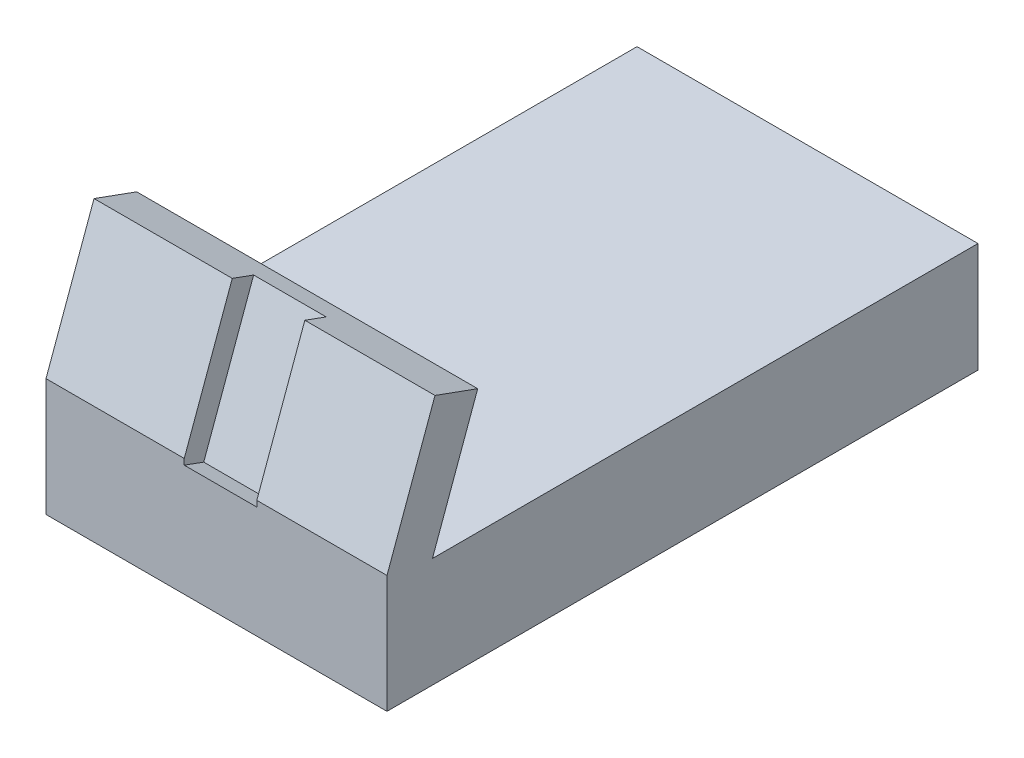
ISO-10303-21;
HEADER;
FILE_DESCRIPTION(('STEP AP214'),'2;1');
FILE_NAME('part.step','',(''),(''),'','','');
FILE_SCHEMA(('AUTOMOTIVE_DESIGN { 1 0 10303 214 1 1 1 1 }'));
ENDSEC;
DATA;
#1=APPLICATION_CONTEXT('core data for automotive mechanical design processes');
#2=APPLICATION_PROTOCOL_DEFINITION('international standard','automotive_design',2000,#1);
#3=PRODUCT_CONTEXT('',#1,'mechanical');
#4=PRODUCT('Part','Part','',(#3));
#5=PRODUCT_RELATED_PRODUCT_CATEGORY('part','',(#4));
#6=PRODUCT_DEFINITION_FORMATION('','',#4);
#7=PRODUCT_DEFINITION_CONTEXT('part definition',#1,'design');
#8=PRODUCT_DEFINITION('design','',#6,#7);
#9=PRODUCT_DEFINITION_SHAPE('','',#8);
#10=(LENGTH_UNIT() NAMED_UNIT(*) SI_UNIT(.MILLI.,.METRE.));
#11=(NAMED_UNIT(*) PLANE_ANGLE_UNIT() SI_UNIT($,.RADIAN.));
#12=(NAMED_UNIT(*) SI_UNIT($,.STERADIAN.) SOLID_ANGLE_UNIT());
#13=UNCERTAINTY_MEASURE_WITH_UNIT(LENGTH_MEASURE(1.E-05),#10,'distance_accuracy_value','');
#14=(GEOMETRIC_REPRESENTATION_CONTEXT(3) GLOBAL_UNCERTAINTY_ASSIGNED_CONTEXT((#13)) GLOBAL_UNIT_ASSIGNED_CONTEXT((#10,
#11,#12)) REPRESENTATION_CONTEXT('',''));
#15=CARTESIAN_POINT('',(0.,0.,0.));
#16=DIRECTION('',(0.,0.,1.));
#17=DIRECTION('',(1.,0.,0.));
#18=AXIS2_PLACEMENT_3D('',#15,#16,#17);
#19=CARTESIAN_POINT('',(-75.,13.8232698070846,65.));
#20=DIRECTION('',(0.,0.342020143325673,0.939692620785907));
#21=DIRECTION('',(0.,-0.939692620785907,0.342020143325673));
#22=AXIS2_PLACEMENT_3D('',#19,#20,#21);
#23=PLANE('',#22);
#24=DIRECTION('',(0.,-0.939692620785907,0.342020143325673));
#25=VECTOR('',#24,1.);
#26=CARTESIAN_POINT('',(-44.591821510971,12.6862417359337,65.4138443734241));
#27=LINE('',#26,#25);
#28=CARTESIAN_POINT('',(-44.591821510971,42.8409779369535,54.4384179741032));
#29=VERTEX_POINT('',#28);
#30=CARTESIAN_POINT('',(-44.591821510971,13.8232698070847,65.));
#31=VERTEX_POINT('',#30);
#32=EDGE_CURVE('E187',#29,#31,#27,.T.);
#33=ORIENTED_EDGE('',*,*,#32,.F.);
#34=DIRECTION('',(1.,0.,0.));
#35=VECTOR('',#34,1.);
#36=CARTESIAN_POINT('',(-75.,42.8409779369535,54.4384179741032));
#37=LINE('',#36,#35);
#38=CARTESIAN_POINT('',(-75.,42.8409779369535,54.4384179741032));
#39=VERTEX_POINT('',#38);
#40=EDGE_CURVE('E137',#39,#29,#37,.T.);
#41=ORIENTED_EDGE('',*,*,#40,.F.);
#42=DIRECTION('',(0.,-0.939692620785907,0.342020143325673));
#43=VECTOR('',#42,1.);
#44=CARTESIAN_POINT('',(-75.,13.8232698070846,65.));
#45=LINE('',#44,#43);
#46=CARTESIAN_POINT('',(-75.,13.8232698070846,65.));
#47=VERTEX_POINT('',#46);
#48=EDGE_CURVE('E132',#39,#47,#45,.T.);
#49=ORIENTED_EDGE('',*,*,#48,.T.);
#50=DIRECTION('',(1.,0.,0.));
#51=VECTOR('',#50,1.);
#52=CARTESIAN_POINT('',(-75.,13.8232698070846,65.));
#53=LINE('',#52,#51);
#54=EDGE_CURVE('E113',#47,#31,#53,.T.);
#55=ORIENTED_EDGE('',*,*,#54,.T.);
#56=EDGE_LOOP('',(#33,#41,#49,#55));
#57=FACE_BOUND('',#56,.T.);
#58=ADVANCED_FACE('F36',(#57),#23,.T.);
#59=CARTESIAN_POINT('',(-75.,-12.06,-65.));
#60=DIRECTION('',(0.,0.,-1.));
#61=DIRECTION('',(-1.,0.,0.));
#62=AXIS2_PLACEMENT_3D('',#59,#60,#61);
#63=PLANE('',#62);
#64=DIRECTION('',(0.,1.,0.));
#65=VECTOR('',#64,1.);
#66=CARTESIAN_POINT('',(0.,-12.06,-65.));
#67=LINE('',#66,#65);
#68=CARTESIAN_POINT('',(0.,-12.06,-65.));
#69=VERTEX_POINT('',#68);
#70=CARTESIAN_POINT('',(0.,12.06,-65.));
#71=VERTEX_POINT('',#70);
#72=EDGE_CURVE('E145',#69,#71,#67,.T.);
#73=ORIENTED_EDGE('',*,*,#72,.F.);
#74=DIRECTION('',(1.,0.,0.));
#75=VECTOR('',#74,1.);
#76=CARTESIAN_POINT('',(-75.,-12.06,-65.));
#77=LINE('',#76,#75);
#78=CARTESIAN_POINT('',(-75.,-12.06,-65.));
#79=VERTEX_POINT('',#78);
#80=EDGE_CURVE('E60',#79,#69,#77,.T.);
#81=ORIENTED_EDGE('',*,*,#80,.F.);
#82=DIRECTION('',(0.,1.,0.));
#83=VECTOR('',#82,1.);
#84=CARTESIAN_POINT('',(-75.,-12.06,-65.));
#85=LINE('',#84,#83);
#86=CARTESIAN_POINT('',(-75.,12.06,-65.));
#87=VERTEX_POINT('',#86);
#88=EDGE_CURVE('E166',#79,#87,#85,.T.);
#89=ORIENTED_EDGE('',*,*,#88,.T.);
#90=DIRECTION('',(1.,0.,0.));
#91=VECTOR('',#90,1.);
#92=CARTESIAN_POINT('',(-75.,12.06,-65.));
#93=LINE('',#92,#91);
#94=EDGE_CURVE('E96',#87,#71,#93,.T.);
#95=ORIENTED_EDGE('',*,*,#94,.T.);
#96=EDGE_LOOP('',(#73,#81,#89,#95));
#97=FACE_BOUND('',#96,.T.);
#98=ADVANCED_FACE('F38',(#97),#63,.T.);
#99=CARTESIAN_POINT('',(-75.,-12.06,-65.));
#100=DIRECTION('',(0.,-1.,0.));
#101=DIRECTION('',(0.,0.,-1.));
#102=AXIS2_PLACEMENT_3D('',#99,#100,#101);
#103=PLANE('',#102);
#104=DIRECTION('',(0.,0.,-1.));
#105=VECTOR('',#104,1.);
#106=CARTESIAN_POINT('',(0.,-12.06,-65.));
#107=LINE('',#106,#105);
#108=CARTESIAN_POINT('',(0.,-12.06,65.));
#109=VERTEX_POINT('',#108);
#110=EDGE_CURVE('E163',#109,#69,#107,.T.);
#111=ORIENTED_EDGE('',*,*,#110,.F.);
#112=DIRECTION('',(1.,0.,0.));
#113=VECTOR('',#112,1.);
#114=CARTESIAN_POINT('',(-75.,-12.06,65.));
#115=LINE('',#114,#113);
#116=CARTESIAN_POINT('',(-75.,-12.06,65.));
#117=VERTEX_POINT('',#116);
#118=EDGE_CURVE('E125',#117,#109,#115,.T.);
#119=ORIENTED_EDGE('',*,*,#118,.F.);
#120=DIRECTION('',(0.,0.,-1.));
#121=VECTOR('',#120,1.);
#122=CARTESIAN_POINT('',(-75.,-12.06,-65.));
#123=LINE('',#122,#121);
#124=EDGE_CURVE('E134',#117,#79,#123,.T.);
#125=ORIENTED_EDGE('',*,*,#124,.T.);
#126=ORIENTED_EDGE('',*,*,#80,.T.);
#127=EDGE_LOOP('',(#111,#119,#125,#126));
#128=FACE_BOUND('',#127,.T.);
#129=ADVANCED_FACE('F249',(#128),#103,.T.);
#130=CARTESIAN_POINT('',(-75.,13.8232698070846,65.));
#131=DIRECTION('',(0.,0.,1.));
#132=DIRECTION('',(1.,0.,0.));
#133=AXIS2_PLACEMENT_3D('',#130,#131,#132);
#134=PLANE('',#133);
#135=DIRECTION('',(0.,-1.,0.));
#136=VECTOR('',#135,1.);
#137=CARTESIAN_POINT('',(-44.591821510971,13.8232698070846,65.));
#138=LINE('',#137,#136);
#139=CARTESIAN_POINT('',(-44.591821510971,12.5356147023888,65.));
#140=VERTEX_POINT('',#139);
#141=EDGE_CURVE('E121',#31,#140,#138,.T.);
#142=ORIENTED_EDGE('',*,*,#141,.F.);
#143=ORIENTED_EDGE('',*,*,#54,.F.);
#144=DIRECTION('',(0.,-1.,0.));
#145=VECTOR('',#144,1.);
#146=CARTESIAN_POINT('',(-75.,13.8232698070846,65.));
#147=LINE('',#146,#145);
#148=EDGE_CURVE('E116',#47,#117,#147,.T.);
#149=ORIENTED_EDGE('',*,*,#148,.T.);
#150=ORIENTED_EDGE('',*,*,#118,.T.);
#151=DIRECTION('',(0.,-1.,0.));
#152=VECTOR('',#151,1.);
#153=CARTESIAN_POINT('',(0.,13.8232698070846,65.));
#154=LINE('',#153,#152);
#155=CARTESIAN_POINT('',(0.,13.8232698070846,65.));
#156=VERTEX_POINT('',#155);
#157=EDGE_CURVE('E160',#156,#109,#154,.T.);
#158=ORIENTED_EDGE('',*,*,#157,.F.);
#159=CARTESIAN_POINT('',(-28.631821510971,13.8232698070847,65.));
#160=VERTEX_POINT('',#159);
#161=EDGE_CURVE('E126',#160,#156,#53,.T.);
#162=ORIENTED_EDGE('',*,*,#161,.F.);
#163=DIRECTION('',(0.,1.,0.));
#164=VECTOR('',#163,1.);
#165=CARTESIAN_POINT('',(-28.631821510971,13.8232698070846,65.));
#166=LINE('',#165,#164);
#167=CARTESIAN_POINT('',(-28.631821510971,12.5356147023888,65.));
#168=VERTEX_POINT('',#167);
#169=EDGE_CURVE('E209',#168,#160,#166,.T.);
#170=ORIENTED_EDGE('',*,*,#169,.F.);
#171=DIRECTION('',(1.,0.,0.));
#172=VECTOR('',#171,1.);
#173=CARTESIAN_POINT('',(-75.,12.5356147023888,65.));
#174=LINE('',#173,#172);
#175=EDGE_CURVE('E11',#140,#168,#174,.T.);
#176=ORIENTED_EDGE('',*,*,#175,.F.);
#177=EDGE_LOOP('',(#142,#143,#149,#150,#158,#162,#170,#176));
#178=FACE_BOUND('',#177,.T.);
#179=ADVANCED_FACE('F115',(#178),#134,.T.);
#180=DIRECTION('',(0.,0.939692620785907,-0.342020143325673));
#181=VECTOR('',#180,1.);
#182=CARTESIAN_POINT('',(-28.631821510971,12.6862417359337,65.4138443734241));
#183=LINE('',#182,#181);
#184=CARTESIAN_POINT('',(-28.631821510971,42.8409779369535,54.4384179741032));
#185=VERTEX_POINT('',#184);
#186=EDGE_CURVE('E195',#160,#185,#183,.T.);
#187=ORIENTED_EDGE('',*,*,#186,.F.);
#188=ORIENTED_EDGE('',*,*,#161,.T.);
#189=DIRECTION('',(0.,-0.939692620785907,0.342020143325673));
#190=VECTOR('',#189,1.);
#191=CARTESIAN_POINT('',(0.,13.8232698070846,65.));
#192=LINE('',#191,#190);
#193=CARTESIAN_POINT('',(0.,42.8409779369535,54.4384179741032));
#194=VERTEX_POINT('',#193);
#195=EDGE_CURVE('E157',#194,#156,#192,.T.);
#196=ORIENTED_EDGE('',*,*,#195,.F.);
#197=EDGE_CURVE('E171',#185,#194,#37,.T.);
#198=ORIENTED_EDGE('',*,*,#197,.F.);
#199=EDGE_LOOP('',(#187,#188,#196,#198));
#200=FACE_BOUND('',#199,.T.);
#201=ADVANCED_FACE('F243',(#200),#23,.T.);
#202=CARTESIAN_POINT('',(-75.,42.8409779369535,54.4384179741032));
#203=DIRECTION('',(0.,0.939804404534439,-0.341712863699434));
#204=DIRECTION('',(0.,0.341712863699434,0.939804404534439));
#205=AXIS2_PLACEMENT_3D('',#202,#203,#204);
#206=PLANE('',#205);
#207=DIRECTION('',(0.,0.341712863699434,0.939804404534439));
#208=VECTOR('',#207,1.);
#209=CARTESIAN_POINT('',(-44.591821510971,42.8409779369535,54.4384179741032));
#210=LINE('',#209,#208);
#211=CARTESIAN_POINT('',(-44.591821510971,41.1324135271196,49.7393957002298));
#212=VERTEX_POINT('',#211);
#213=EDGE_CURVE('E44',#212,#29,#210,.T.);
#214=ORIENTED_EDGE('',*,*,#213,.F.);
#215=DIRECTION('',(1.,0.,0.));
#216=VECTOR('',#215,1.);
#217=CARTESIAN_POINT('',(-75.,41.1324135271196,49.7393957002298));
#218=LINE('',#217,#216);
#219=CARTESIAN_POINT('',(-28.631821510971,41.1324135271195,49.7393957002298));
#220=VERTEX_POINT('',#219);
#221=EDGE_CURVE('E168',#212,#220,#218,.T.);
#222=ORIENTED_EDGE('',*,*,#221,.T.);
#223=DIRECTION('',(0.,-0.341712863699434,-0.939804404534439));
#224=VECTOR('',#223,1.);
#225=CARTESIAN_POINT('',(-28.631821510971,42.8409779369535,54.4384179741032));
#226=LINE('',#225,#224);
#227=EDGE_CURVE('E179',#185,#220,#226,.T.);
#228=ORIENTED_EDGE('',*,*,#227,.F.);
#229=ORIENTED_EDGE('',*,*,#197,.T.);
#230=DIRECTION('',(0.,0.341712863699434,0.939804404534439));
#231=VECTOR('',#230,1.);
#232=CARTESIAN_POINT('',(0.,42.8409779369535,54.4384179741032));
#233=LINE('',#232,#231);
#234=CARTESIAN_POINT('',(0.,39.4238491172856,45.0403734263564));
#235=VERTEX_POINT('',#234);
#236=EDGE_CURVE('E154',#235,#194,#233,.T.);
#237=ORIENTED_EDGE('',*,*,#236,.F.);
#238=DIRECTION('',(1.,0.,0.));
#239=VECTOR('',#238,1.);
#240=CARTESIAN_POINT('',(-75.,39.4238491172856,45.0403734263564));
#241=LINE('',#240,#239);
#242=CARTESIAN_POINT('',(-75.,39.4238491172856,45.0403734263564));
#243=VERTEX_POINT('',#242);
#244=EDGE_CURVE('E172',#243,#235,#241,.T.);
#245=ORIENTED_EDGE('',*,*,#244,.F.);
#246=DIRECTION('',(0.,0.341712863699434,0.939804404534439));
#247=VECTOR('',#246,1.);
#248=CARTESIAN_POINT('',(-75.,42.8409779369535,54.4384179741032));
#249=LINE('',#248,#247);
#250=EDGE_CURVE('E138',#243,#39,#249,.T.);
#251=ORIENTED_EDGE('',*,*,#250,.T.);
#252=ORIENTED_EDGE('',*,*,#40,.T.);
#253=EDGE_LOOP('',(#214,#222,#228,#229,#237,#245,#251,#252));
#254=FACE_BOUND('',#253,.T.);
#255=ADVANCED_FACE('F197',(#254),#206,.T.);
#256=CARTESIAN_POINT('',(-75.,12.06,55.));
#257=DIRECTION('',(0.,-0.342020143325673,-0.939692620785907));
#258=DIRECTION('',(0.,0.939692620785907,-0.342020143325673));
#259=AXIS2_PLACEMENT_3D('',#256,#257,#258);
#260=PLANE('',#259);
#261=DIRECTION('',(0.,0.939692620785907,-0.342020143325673));
#262=VECTOR('',#261,1.);
#263=CARTESIAN_POINT('',(0.,12.06,55.));
#264=LINE('',#263,#262);
#265=CARTESIAN_POINT('',(0.,12.06,55.));
#266=VERTEX_POINT('',#265);
#267=EDGE_CURVE('E151',#266,#235,#264,.T.);
#268=ORIENTED_EDGE('',*,*,#267,.F.);
#269=DIRECTION('',(1.,0.,0.));
#270=VECTOR('',#269,1.);
#271=CARTESIAN_POINT('',(-75.,12.06,55.));
#272=LINE('',#271,#270);
#273=CARTESIAN_POINT('',(-75.,12.06,55.));
#274=VERTEX_POINT('',#273);
#275=EDGE_CURVE('E174',#274,#266,#272,.T.);
#276=ORIENTED_EDGE('',*,*,#275,.F.);
#277=DIRECTION('',(0.,0.939692620785907,-0.342020143325673));
#278=VECTOR('',#277,1.);
#279=CARTESIAN_POINT('',(-75.,12.06,55.));
#280=LINE('',#279,#278);
#281=EDGE_CURVE('E140',#274,#243,#280,.T.);
#282=ORIENTED_EDGE('',*,*,#281,.T.);
#283=ORIENTED_EDGE('',*,*,#244,.T.);
#284=EDGE_LOOP('',(#268,#276,#282,#283));
#285=FACE_BOUND('',#284,.T.);
#286=ADVANCED_FACE('F203',(#285),#260,.T.);
#287=CARTESIAN_POINT('',(-75.,12.06,-65.));
#288=DIRECTION('',(0.,1.,0.));
#289=DIRECTION('',(0.,0.,1.));
#290=AXIS2_PLACEMENT_3D('',#287,#288,#289);
#291=PLANE('',#290);
#292=DIRECTION('',(0.,0.,1.));
#293=VECTOR('',#292,1.);
#294=CARTESIAN_POINT('',(0.,12.06,-65.));
#295=LINE('',#294,#293);
#296=EDGE_CURVE('E148',#71,#266,#295,.T.);
#297=ORIENTED_EDGE('',*,*,#296,.F.);
#298=ORIENTED_EDGE('',*,*,#94,.F.);
#299=DIRECTION('',(0.,0.,1.));
#300=VECTOR('',#299,1.);
#301=CARTESIAN_POINT('',(-75.,12.06,-65.));
#302=LINE('',#301,#300);
#303=EDGE_CURVE('E204',#87,#274,#302,.T.);
#304=ORIENTED_EDGE('',*,*,#303,.T.);
#305=ORIENTED_EDGE('',*,*,#275,.T.);
#306=EDGE_LOOP('',(#297,#298,#304,#305));
#307=FACE_BOUND('',#306,.T.);
#308=ADVANCED_FACE('F248',(#307),#291,.T.);
#309=CARTESIAN_POINT('',(-75.,0.,0.));
#310=DIRECTION('',(1.,0.,0.));
#311=DIRECTION('',(0.,0.,-1.));
#312=AXIS2_PLACEMENT_3D('',#309,#310,#311);
#313=PLANE('',#312);
#314=ORIENTED_EDGE('',*,*,#88,.F.);
#315=ORIENTED_EDGE('',*,*,#124,.F.);
#316=ORIENTED_EDGE('',*,*,#148,.F.);
#317=ORIENTED_EDGE('',*,*,#48,.F.);
#318=ORIENTED_EDGE('',*,*,#250,.F.);
#319=ORIENTED_EDGE('',*,*,#281,.F.);
#320=ORIENTED_EDGE('',*,*,#303,.F.);
#321=EDGE_LOOP('',(#314,#315,#316,#317,#318,#319,#320));
#322=FACE_BOUND('',#321,.T.);
#323=ADVANCED_FACE('F130',(#322),#313,.F.);
#324=CARTESIAN_POINT('',(0.,0.,0.));
#325=DIRECTION('',(1.,0.,0.));
#326=DIRECTION('',(0.,0.,-1.));
#327=AXIS2_PLACEMENT_3D('',#324,#325,#326);
#328=PLANE('',#327);
#329=ORIENTED_EDGE('',*,*,#72,.T.);
#330=ORIENTED_EDGE('',*,*,#296,.T.);
#331=ORIENTED_EDGE('',*,*,#267,.T.);
#332=ORIENTED_EDGE('',*,*,#236,.T.);
#333=ORIENTED_EDGE('',*,*,#195,.T.);
#334=ORIENTED_EDGE('',*,*,#157,.T.);
#335=ORIENTED_EDGE('',*,*,#110,.T.);
#336=EDGE_LOOP('',(#329,#330,#331,#332,#333,#334,#335));
#337=FACE_BOUND('',#336,.T.);
#338=ADVANCED_FACE('F247',(#337),#328,.T.);
#339=CARTESIAN_POINT('',(-44.591821510971,10.9761410193053,60.7153812694946));
#340=DIRECTION('',(-1.,0.,0.));
#341=DIRECTION('',(0.,0.,1.));
#342=AXIS2_PLACEMENT_3D('',#339,#340,#341);
#343=PLANE('',#342);
#344=ORIENTED_EDGE('',*,*,#141,.T.);
#345=DIRECTION('',(0.,0.342020143325673,0.939692620785907));
#346=VECTOR('',#345,1.);
#347=CARTESIAN_POINT('',(-44.591821510971,10.9761410193053,60.7153812694946));
#348=LINE('',#347,#346);
#349=CARTESIAN_POINT('',(-44.591821510971,10.9761410193053,60.7153812694946));
#350=VERTEX_POINT('',#349);
#351=EDGE_CURVE('E213',#350,#140,#348,.T.);
#352=ORIENTED_EDGE('',*,*,#351,.F.);
#353=DIRECTION('',(0.,-0.939692620785907,0.342020143325673));
#354=VECTOR('',#353,1.);
#355=CARTESIAN_POINT('',(-44.591821510971,10.9761410193053,60.7153812694946));
#356=LINE('',#355,#354);
#357=EDGE_CURVE('E191',#212,#350,#356,.T.);
#358=ORIENTED_EDGE('',*,*,#357,.F.);
#359=ORIENTED_EDGE('',*,*,#213,.T.);
#360=ORIENTED_EDGE('',*,*,#32,.T.);
#361=EDGE_LOOP('',(#344,#352,#358,#359,#360));
#362=FACE_BOUND('',#361,.T.);
#363=ADVANCED_FACE('F186',(#362),#343,.F.);
#364=CARTESIAN_POINT('',(-28.631821510971,10.9761410193054,60.7153812694946));
#365=DIRECTION('',(1.,0.,0.));
#366=DIRECTION('',(0.,0.,-1.));
#367=AXIS2_PLACEMENT_3D('',#364,#365,#366);
#368=PLANE('',#367);
#369=ORIENTED_EDGE('',*,*,#169,.T.);
#370=ORIENTED_EDGE('',*,*,#186,.T.);
#371=ORIENTED_EDGE('',*,*,#227,.T.);
#372=DIRECTION('',(0.,0.939692620785907,-0.342020143325673));
#373=VECTOR('',#372,1.);
#374=CARTESIAN_POINT('',(-28.631821510971,10.9761410193054,60.7153812694946));
#375=LINE('',#374,#373);
#376=CARTESIAN_POINT('',(-28.631821510971,10.9761410193054,60.7153812694946));
#377=VERTEX_POINT('',#376);
#378=EDGE_CURVE('E51',#377,#220,#375,.T.);
#379=ORIENTED_EDGE('',*,*,#378,.F.);
#380=DIRECTION('',(0.,0.342020143325673,0.939692620785907));
#381=VECTOR('',#380,1.);
#382=CARTESIAN_POINT('',(-28.631821510971,10.9761410193054,60.7153812694946));
#383=LINE('',#382,#381);
#384=EDGE_CURVE('E212',#377,#168,#383,.T.);
#385=ORIENTED_EDGE('',*,*,#384,.T.);
#386=EDGE_LOOP('',(#369,#370,#371,#379,#385));
#387=FACE_BOUND('',#386,.T.);
#388=ADVANCED_FACE('F234',(#387),#368,.F.);
#389=CARTESIAN_POINT('',(-28.631821510971,10.9761410193054,60.7153812694946));
#390=DIRECTION('',(0.,-0.939692620785907,0.342020143325673));
#391=DIRECTION('',(0.,-0.342020143325673,-0.939692620785907));
#392=AXIS2_PLACEMENT_3D('',#389,#390,#391);
#393=PLANE('',#392);
#394=ORIENTED_EDGE('',*,*,#175,.T.);
#395=ORIENTED_EDGE('',*,*,#384,.F.);
#396=DIRECTION('',(1.,0.,0.));
#397=VECTOR('',#396,1.);
#398=CARTESIAN_POINT('',(-28.631821510971,10.9761410193054,60.7153812694946));
#399=LINE('',#398,#397);
#400=EDGE_CURVE('E221',#350,#377,#399,.T.);
#401=ORIENTED_EDGE('',*,*,#400,.F.);
#402=ORIENTED_EDGE('',*,*,#351,.T.);
#403=EDGE_LOOP('',(#394,#395,#401,#402));
#404=FACE_BOUND('',#403,.T.);
#405=ADVANCED_FACE('F229',(#404),#393,.F.);
#406=CARTESIAN_POINT('',(0.,20.797511991001,57.1406945761112));
#407=DIRECTION('',(0.,0.342020143325673,0.939692620785907));
#408=DIRECTION('',(0.,-0.939692620785907,0.342020143325673));
#409=AXIS2_PLACEMENT_3D('',#406,#407,#408);
#410=PLANE('',#409);
#411=ORIENTED_EDGE('',*,*,#357,.T.);
#412=ORIENTED_EDGE('',*,*,#400,.T.);
#413=ORIENTED_EDGE('',*,*,#378,.T.);
#414=ORIENTED_EDGE('',*,*,#221,.F.);
#415=EDGE_LOOP('',(#411,#412,#413,#414));
#416=FACE_BOUND('',#415,.T.);
#417=ADVANCED_FACE('F224',(#416),#410,.T.);
#418=CLOSED_SHELL('',(#58,#98,#129,#179,#201,#255,#286,#308,#323,#338,#363,#388,#405,#417));
#419=MANIFOLD_SOLID_BREP('B2',#418);
#420=ADVANCED_BREP_SHAPE_REPRESENTATION('',(#18,#419),#14);
#421=SHAPE_DEFINITION_REPRESENTATION(#9,#420);
ENDSEC;
END-ISO-10303-21;
